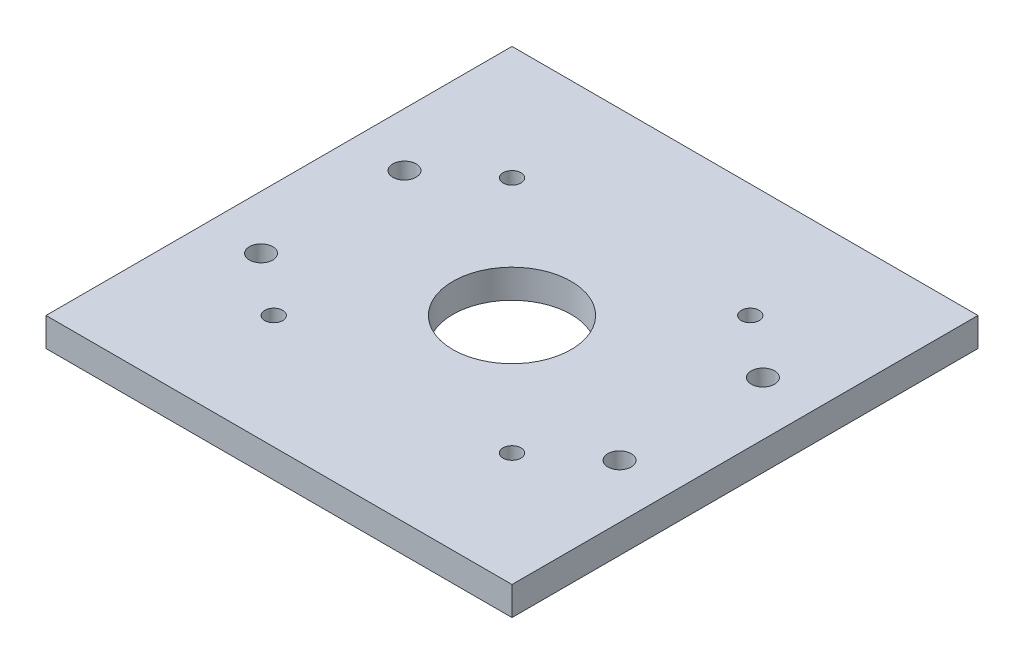
ISO-10303-21;
HEADER;
FILE_DESCRIPTION(('STEP AP214'),'2;1');
FILE_NAME('part.step','',(''),(''),'','','');
FILE_SCHEMA(('AUTOMOTIVE_DESIGN { 1 0 10303 214 1 1 1 1 }'));
ENDSEC;
DATA;
#1=APPLICATION_CONTEXT('core data for automotive mechanical design processes');
#2=APPLICATION_PROTOCOL_DEFINITION('international standard','automotive_design',2000,#1);
#3=PRODUCT_CONTEXT('',#1,'mechanical');
#4=PRODUCT('Part','Part','',(#3));
#5=PRODUCT_RELATED_PRODUCT_CATEGORY('part','',(#4));
#6=PRODUCT_DEFINITION_FORMATION('','',#4);
#7=PRODUCT_DEFINITION_CONTEXT('part definition',#1,'design');
#8=PRODUCT_DEFINITION('design','',#6,#7);
#9=PRODUCT_DEFINITION_SHAPE('','',#8);
#10=(LENGTH_UNIT() NAMED_UNIT(*) SI_UNIT(.MILLI.,.METRE.));
#11=(NAMED_UNIT(*) PLANE_ANGLE_UNIT() SI_UNIT($,.RADIAN.));
#12=(NAMED_UNIT(*) SI_UNIT($,.STERADIAN.) SOLID_ANGLE_UNIT());
#13=UNCERTAINTY_MEASURE_WITH_UNIT(LENGTH_MEASURE(1.E-05),#10,'distance_accuracy_value','');
#14=(GEOMETRIC_REPRESENTATION_CONTEXT(3) GLOBAL_UNCERTAINTY_ASSIGNED_CONTEXT((#13)) GLOBAL_UNIT_ASSIGNED_CONTEXT((#10,
#11,#12)) REPRESENTATION_CONTEXT('',''));
#15=CARTESIAN_POINT('',(0.,0.,0.));
#16=DIRECTION('',(0.,0.,1.));
#17=DIRECTION('',(1.,0.,0.));
#18=AXIS2_PLACEMENT_3D('',#15,#16,#17);
#19=CARTESIAN_POINT('',(0.,8.,0.));
#20=DIRECTION('',(0.,-1.,0.));
#21=DIRECTION('',(0.,0.,-1.));
#22=AXIS2_PLACEMENT_3D('',#19,#20,#21);
#23=PLANE('',#22);
#24=CARTESIAN_POINT('',(-301.704286076689,8.,109.175068710218));
#25=DIRECTION('',(0.,1.,0.));
#26=DIRECTION('',(0.,0.,1.));
#27=AXIS2_PLACEMENT_3D('',#24,#25,#26);
#28=CIRCLE('',#27,2.5);
#29=CARTESIAN_POINT('',(-301.704286076689,8.,111.675068710218));
#30=VERTEX_POINT('',#29);
#31=EDGE_CURVE('E210',#30,#30,#28,.T.);
#32=ORIENTED_EDGE('',*,*,#31,.F.);
#33=EDGE_LOOP('',(#32));
#34=FACE_BOUND('',#33,.T.);
#35=CARTESIAN_POINT('',(-235.236286076689,8.,109.175068710218));
#36=DIRECTION('',(0.,1.,0.));
#37=DIRECTION('',(0.,0.,1.));
#38=AXIS2_PLACEMENT_3D('',#35,#36,#37);
#39=CIRCLE('',#38,2.5);
#40=CARTESIAN_POINT('',(-235.236286076689,8.,111.675068710218));
#41=VERTEX_POINT('',#40);
#42=EDGE_CURVE('E200',#41,#41,#39,.T.);
#43=ORIENTED_EDGE('',*,*,#42,.F.);
#44=EDGE_LOOP('',(#43));
#45=FACE_BOUND('',#44,.T.);
#46=CARTESIAN_POINT('',(-218.470286076689,8.,162.409068710218));
#47=DIRECTION('',(0.,1.,0.));
#48=DIRECTION('',(0.,0.,1.));
#49=AXIS2_PLACEMENT_3D('',#46,#47,#48);
#50=CIRCLE('',#49,3.25000000000001);
#51=CARTESIAN_POINT('',(-218.470286076689,8.,165.659068710218));
#52=VERTEX_POINT('',#51);
#53=EDGE_CURVE('E159',#52,#52,#50,.T.);
#54=ORIENTED_EDGE('',*,*,#53,.F.);
#55=EDGE_LOOP('',(#54));
#56=FACE_BOUND('',#55,.T.);
#57=CARTESIAN_POINT('',(-218.470286076689,8.,122.409068710218));
#58=DIRECTION('',(0.,1.,0.));
#59=DIRECTION('',(0.,0.,1.));
#60=AXIS2_PLACEMENT_3D('',#57,#58,#59);
#61=CIRCLE('',#60,3.25000000000001);
#62=CARTESIAN_POINT('',(-218.470286076689,8.,125.659068710218));
#63=VERTEX_POINT('',#62);
#64=EDGE_CURVE('E166',#63,#63,#61,.T.);
#65=ORIENTED_EDGE('',*,*,#64,.F.);
#66=EDGE_LOOP('',(#65));
#67=FACE_BOUND('',#66,.T.);
#68=CARTESIAN_POINT('',(-318.470286076689,8.,122.409068710218));
#69=DIRECTION('',(0.,1.,0.));
#70=DIRECTION('',(0.,0.,1.));
#71=AXIS2_PLACEMENT_3D('',#68,#69,#70);
#72=CIRCLE('',#71,3.24999999999995);
#73=CARTESIAN_POINT('',(-318.470286076689,8.,125.659068710218));
#74=VERTEX_POINT('',#73);
#75=EDGE_CURVE('E155',#74,#74,#72,.T.);
#76=ORIENTED_EDGE('',*,*,#75,.F.);
#77=EDGE_LOOP('',(#76));
#78=FACE_BOUND('',#77,.T.);
#79=CARTESIAN_POINT('',(-318.470286076689,8.,162.409068710218));
#80=DIRECTION('',(0.,1.,0.));
#81=DIRECTION('',(0.,0.,1.));
#82=AXIS2_PLACEMENT_3D('',#79,#80,#81);
#83=CIRCLE('',#82,3.24999999999995);
#84=CARTESIAN_POINT('',(-318.470286076689,8.,165.659068710218));
#85=VERTEX_POINT('',#84);
#86=EDGE_CURVE('E146',#85,#85,#83,.T.);
#87=ORIENTED_EDGE('',*,*,#86,.F.);
#88=EDGE_LOOP('',(#87));
#89=FACE_BOUND('',#88,.T.);
#90=DIRECTION('',(0.,0.,1.));
#91=VECTOR('',#90,1.);
#92=CARTESIAN_POINT('',(-333.470286076689,8.,207.409068710218));
#93=LINE('',#92,#91);
#94=CARTESIAN_POINT('',(-333.470286076689,8.,77.409068710218));
#95=VERTEX_POINT('',#94);
#96=CARTESIAN_POINT('',(-333.470286076689,8.,207.409068710218));
#97=VERTEX_POINT('',#96);
#98=EDGE_CURVE('E105',#95,#97,#93,.T.);
#99=ORIENTED_EDGE('',*,*,#98,.T.);
#100=DIRECTION('',(1.,0.,0.));
#101=VECTOR('',#100,1.);
#102=CARTESIAN_POINT('',(-333.470286076689,8.,207.409068710218));
#103=LINE('',#102,#101);
#104=CARTESIAN_POINT('',(-203.470286076689,8.,207.409068710218));
#105=VERTEX_POINT('',#104);
#106=EDGE_CURVE('E100',#97,#105,#103,.T.);
#107=ORIENTED_EDGE('',*,*,#106,.T.);
#108=DIRECTION('',(0.,0.,-1.));
#109=VECTOR('',#108,1.);
#110=CARTESIAN_POINT('',(-203.470286076689,8.,207.409068710218));
#111=LINE('',#110,#109);
#112=CARTESIAN_POINT('',(-203.470286076689,8.,77.409068710218));
#113=VERTEX_POINT('',#112);
#114=EDGE_CURVE('E99',#105,#113,#111,.T.);
#115=ORIENTED_EDGE('',*,*,#114,.T.);
#116=DIRECTION('',(-1.,0.,0.));
#117=VECTOR('',#116,1.);
#118=CARTESIAN_POINT('',(-333.470286076689,8.,77.409068710218));
#119=LINE('',#118,#117);
#120=EDGE_CURVE('E67',#113,#95,#119,.T.);
#121=ORIENTED_EDGE('',*,*,#120,.T.);
#122=EDGE_LOOP('',(#99,#107,#115,#121));
#123=FACE_BOUND('',#122,.T.);
#124=CARTESIAN_POINT('',(-268.470286076689,8.,142.409068710218));
#125=DIRECTION('',(0.,1.,0.));
#126=DIRECTION('',(0.,0.,1.));
#127=AXIS2_PLACEMENT_3D('',#124,#125,#126);
#128=CIRCLE('',#127,16.5);
#129=CARTESIAN_POINT('',(-268.470286076689,8.,158.909068710218));
#130=VERTEX_POINT('',#129);
#131=EDGE_CURVE('E122',#130,#130,#128,.T.);
#132=ORIENTED_EDGE('',*,*,#131,.F.);
#133=EDGE_LOOP('',(#132));
#134=FACE_BOUND('',#133,.T.);
#135=CARTESIAN_POINT('',(-301.704286076689,8.,175.643068710218));
#136=DIRECTION('',(0.,1.,0.));
#137=DIRECTION('',(0.,0.,1.));
#138=AXIS2_PLACEMENT_3D('',#135,#136,#137);
#139=CIRCLE('',#138,2.5);
#140=CARTESIAN_POINT('',(-301.704286076689,8.,178.143068710218));
#141=VERTEX_POINT('',#140);
#142=EDGE_CURVE('E181',#141,#141,#139,.T.);
#143=ORIENTED_EDGE('',*,*,#142,.F.);
#144=EDGE_LOOP('',(#143));
#145=FACE_BOUND('',#144,.T.);
#146=CARTESIAN_POINT('',(-235.236286076689,8.,175.643068710218));
#147=DIRECTION('',(0.,1.,0.));
#148=DIRECTION('',(0.,0.,1.));
#149=AXIS2_PLACEMENT_3D('',#146,#147,#148);
#150=CIRCLE('',#149,2.5);
#151=CARTESIAN_POINT('',(-235.236286076689,8.,178.143068710218));
#152=VERTEX_POINT('',#151);
#153=EDGE_CURVE('E191',#152,#152,#150,.T.);
#154=ORIENTED_EDGE('',*,*,#153,.F.);
#155=EDGE_LOOP('',(#154));
#156=FACE_BOUND('',#155,.T.);
#157=ADVANCED_FACE('F47',(#34,#45,#56,#67,#78,#89,#123,#134,#145,#156),#23,.F.);
#158=CARTESIAN_POINT('',(0.,0.,0.));
#159=DIRECTION('',(0.,-1.,0.));
#160=DIRECTION('',(0.,0.,-1.));
#161=AXIS2_PLACEMENT_3D('',#158,#159,#160);
#162=PLANE('',#161);
#163=CARTESIAN_POINT('',(-301.704286076689,0.,109.175068710218));
#164=DIRECTION('',(0.,1.,0.));
#165=DIRECTION('',(0.,0.,1.));
#166=AXIS2_PLACEMENT_3D('',#163,#164,#165);
#167=CIRCLE('',#166,2.5);
#168=CARTESIAN_POINT('',(-301.704286076689,0.,111.675068710218));
#169=VERTEX_POINT('',#168);
#170=EDGE_CURVE('E201',#169,#169,#167,.T.);
#171=ORIENTED_EDGE('',*,*,#170,.T.);
#172=EDGE_LOOP('',(#171));
#173=FACE_BOUND('',#172,.T.);
#174=CARTESIAN_POINT('',(-235.236286076689,0.,109.175068710218));
#175=DIRECTION('',(0.,1.,0.));
#176=DIRECTION('',(0.,0.,1.));
#177=AXIS2_PLACEMENT_3D('',#174,#175,#176);
#178=CIRCLE('',#177,2.5);
#179=CARTESIAN_POINT('',(-235.236286076689,0.,111.675068710218));
#180=VERTEX_POINT('',#179);
#181=EDGE_CURVE('E195',#180,#180,#178,.T.);
#182=ORIENTED_EDGE('',*,*,#181,.T.);
#183=EDGE_LOOP('',(#182));
#184=FACE_BOUND('',#183,.T.);
#185=CARTESIAN_POINT('',(-235.236286076689,0.,175.643068710218));
#186=DIRECTION('',(0.,1.,0.));
#187=DIRECTION('',(0.,0.,1.));
#188=AXIS2_PLACEMENT_3D('',#185,#186,#187);
#189=CIRCLE('',#188,2.5);
#190=CARTESIAN_POINT('',(-235.236286076689,0.,178.143068710218));
#191=VERTEX_POINT('',#190);
#192=EDGE_CURVE('E190',#191,#191,#189,.T.);
#193=ORIENTED_EDGE('',*,*,#192,.T.);
#194=EDGE_LOOP('',(#193));
#195=FACE_BOUND('',#194,.T.);
#196=CARTESIAN_POINT('',(-268.470286076689,0.,142.409068710218));
#197=DIRECTION('',(0.,1.,0.));
#198=DIRECTION('',(0.,0.,1.));
#199=AXIS2_PLACEMENT_3D('',#196,#197,#198);
#200=CIRCLE('',#199,16.5);
#201=CARTESIAN_POINT('',(-268.470286076689,0.,158.909068710218));
#202=VERTEX_POINT('',#201);
#203=EDGE_CURVE('E140',#202,#202,#200,.T.);
#204=ORIENTED_EDGE('',*,*,#203,.T.);
#205=EDGE_LOOP('',(#204));
#206=FACE_BOUND('',#205,.T.);
#207=DIRECTION('',(0.,0.,1.));
#208=VECTOR('',#207,1.);
#209=CARTESIAN_POINT('',(-333.470286076689,0.,207.409068710218));
#210=LINE('',#209,#208);
#211=CARTESIAN_POINT('',(-333.470286076689,0.,77.409068710218));
#212=VERTEX_POINT('',#211);
#213=CARTESIAN_POINT('',(-333.470286076689,0.,207.409068710218));
#214=VERTEX_POINT('',#213);
#215=EDGE_CURVE('E119',#212,#214,#210,.T.);
#216=ORIENTED_EDGE('',*,*,#215,.F.);
#217=DIRECTION('',(-1.,0.,0.));
#218=VECTOR('',#217,1.);
#219=CARTESIAN_POINT('',(-333.470286076689,0.,77.409068710218));
#220=LINE('',#219,#218);
#221=CARTESIAN_POINT('',(-203.470286076689,0.,77.409068710218));
#222=VERTEX_POINT('',#221);
#223=EDGE_CURVE('E89',#222,#212,#220,.T.);
#224=ORIENTED_EDGE('',*,*,#223,.F.);
#225=DIRECTION('',(0.,0.,-1.));
#226=VECTOR('',#225,1.);
#227=CARTESIAN_POINT('',(-203.470286076689,0.,207.409068710218));
#228=LINE('',#227,#226);
#229=CARTESIAN_POINT('',(-203.470286076689,0.,207.409068710218));
#230=VERTEX_POINT('',#229);
#231=EDGE_CURVE('E83',#230,#222,#228,.T.);
#232=ORIENTED_EDGE('',*,*,#231,.F.);
#233=DIRECTION('',(1.,0.,0.));
#234=VECTOR('',#233,1.);
#235=CARTESIAN_POINT('',(-333.470286076689,0.,207.409068710218));
#236=LINE('',#235,#234);
#237=EDGE_CURVE('E110',#214,#230,#236,.T.);
#238=ORIENTED_EDGE('',*,*,#237,.F.);
#239=EDGE_LOOP('',(#216,#224,#232,#238));
#240=FACE_BOUND('',#239,.T.);
#241=CARTESIAN_POINT('',(-318.470286076689,0.,162.409068710218));
#242=DIRECTION('',(0.,1.,0.));
#243=DIRECTION('',(0.,0.,1.));
#244=AXIS2_PLACEMENT_3D('',#241,#242,#243);
#245=CIRCLE('',#244,3.24999999999995);
#246=CARTESIAN_POINT('',(-318.470286076689,0.,165.659068710218));
#247=VERTEX_POINT('',#246);
#248=EDGE_CURVE('E145',#247,#247,#245,.T.);
#249=ORIENTED_EDGE('',*,*,#248,.T.);
#250=EDGE_LOOP('',(#249));
#251=FACE_BOUND('',#250,.T.);
#252=CARTESIAN_POINT('',(-318.470286076689,0.,122.409068710218));
#253=DIRECTION('',(0.,1.,0.));
#254=DIRECTION('',(0.,0.,1.));
#255=AXIS2_PLACEMENT_3D('',#252,#253,#254);
#256=CIRCLE('',#255,3.24999999999995);
#257=CARTESIAN_POINT('',(-318.470286076689,0.,125.659068710218));
#258=VERTEX_POINT('',#257);
#259=EDGE_CURVE('E174',#258,#258,#256,.T.);
#260=ORIENTED_EDGE('',*,*,#259,.T.);
#261=EDGE_LOOP('',(#260));
#262=FACE_BOUND('',#261,.T.);
#263=CARTESIAN_POINT('',(-218.470286076689,0.,122.409068710218));
#264=DIRECTION('',(0.,1.,0.));
#265=DIRECTION('',(0.,0.,1.));
#266=AXIS2_PLACEMENT_3D('',#263,#264,#265);
#267=CIRCLE('',#266,3.25000000000001);
#268=CARTESIAN_POINT('',(-218.470286076689,0.,125.659068710218));
#269=VERTEX_POINT('',#268);
#270=EDGE_CURVE('E164',#269,#269,#267,.T.);
#271=ORIENTED_EDGE('',*,*,#270,.T.);
#272=EDGE_LOOP('',(#271));
#273=FACE_BOUND('',#272,.T.);
#274=CARTESIAN_POINT('',(-218.470286076689,0.,162.409068710218));
#275=DIRECTION('',(0.,1.,0.));
#276=DIRECTION('',(0.,0.,1.));
#277=AXIS2_PLACEMENT_3D('',#274,#275,#276);
#278=CIRCLE('',#277,3.25000000000001);
#279=CARTESIAN_POINT('',(-218.470286076689,0.,165.659068710218));
#280=VERTEX_POINT('',#279);
#281=EDGE_CURVE('E156',#280,#280,#278,.T.);
#282=ORIENTED_EDGE('',*,*,#281,.T.);
#283=EDGE_LOOP('',(#282));
#284=FACE_BOUND('',#283,.T.);
#285=CARTESIAN_POINT('',(-301.704286076689,0.,175.643068710218));
#286=DIRECTION('',(0.,1.,0.));
#287=DIRECTION('',(0.,0.,1.));
#288=AXIS2_PLACEMENT_3D('',#285,#286,#287);
#289=CIRCLE('',#288,2.5);
#290=CARTESIAN_POINT('',(-301.704286076689,0.,178.143068710218));
#291=VERTEX_POINT('',#290);
#292=EDGE_CURVE('E161',#291,#291,#289,.T.);
#293=ORIENTED_EDGE('',*,*,#292,.T.);
#294=EDGE_LOOP('',(#293));
#295=FACE_BOUND('',#294,.T.);
#296=ADVANCED_FACE('F133',(#173,#184,#195,#206,#240,#251,#262,#273,#284,#295),#162,.T.);
#297=CARTESIAN_POINT('',(-333.470286076689,8.,207.409068710218));
#298=DIRECTION('',(1.,0.,0.));
#299=DIRECTION('',(0.,0.,-1.));
#300=AXIS2_PLACEMENT_3D('',#297,#298,#299);
#301=PLANE('',#300);
#302=ORIENTED_EDGE('',*,*,#215,.T.);
#303=DIRECTION('',(0.,-1.,0.));
#304=VECTOR('',#303,1.);
#305=CARTESIAN_POINT('',(-333.470286076689,8.,207.409068710218));
#306=LINE('',#305,#304);
#307=EDGE_CURVE('E11',#97,#214,#306,.T.);
#308=ORIENTED_EDGE('',*,*,#307,.F.);
#309=ORIENTED_EDGE('',*,*,#98,.F.);
#310=DIRECTION('',(0.,-1.,0.));
#311=VECTOR('',#310,1.);
#312=CARTESIAN_POINT('',(-333.470286076689,8.,77.409068710218));
#313=LINE('',#312,#311);
#314=EDGE_CURVE('E111',#95,#212,#313,.T.);
#315=ORIENTED_EDGE('',*,*,#314,.T.);
#316=EDGE_LOOP('',(#302,#308,#309,#315));
#317=FACE_BOUND('',#316,.T.);
#318=ADVANCED_FACE('F51',(#317),#301,.F.);
#319=CARTESIAN_POINT('',(-333.470286076689,8.,207.409068710218));
#320=DIRECTION('',(0.,0.,-1.));
#321=DIRECTION('',(-1.,0.,0.));
#322=AXIS2_PLACEMENT_3D('',#319,#320,#321);
#323=PLANE('',#322);
#324=ORIENTED_EDGE('',*,*,#237,.T.);
#325=DIRECTION('',(0.,-1.,0.));
#326=VECTOR('',#325,1.);
#327=CARTESIAN_POINT('',(-203.470286076689,8.,207.409068710218));
#328=LINE('',#327,#326);
#329=EDGE_CURVE('E56',#105,#230,#328,.T.);
#330=ORIENTED_EDGE('',*,*,#329,.F.);
#331=ORIENTED_EDGE('',*,*,#106,.F.);
#332=ORIENTED_EDGE('',*,*,#307,.T.);
#333=EDGE_LOOP('',(#324,#330,#331,#332));
#334=FACE_BOUND('',#333,.T.);
#335=ADVANCED_FACE('F106',(#334),#323,.F.);
#336=CARTESIAN_POINT('',(-203.470286076689,8.,207.409068710218));
#337=DIRECTION('',(-1.,0.,0.));
#338=DIRECTION('',(0.,0.,1.));
#339=AXIS2_PLACEMENT_3D('',#336,#337,#338);
#340=PLANE('',#339);
#341=ORIENTED_EDGE('',*,*,#231,.T.);
#342=DIRECTION('',(0.,-1.,0.));
#343=VECTOR('',#342,1.);
#344=CARTESIAN_POINT('',(-203.470286076689,8.,77.409068710218));
#345=LINE('',#344,#343);
#346=EDGE_CURVE('E108',#113,#222,#345,.T.);
#347=ORIENTED_EDGE('',*,*,#346,.F.);
#348=ORIENTED_EDGE('',*,*,#114,.F.);
#349=ORIENTED_EDGE('',*,*,#329,.T.);
#350=EDGE_LOOP('',(#341,#347,#348,#349));
#351=FACE_BOUND('',#350,.T.);
#352=ADVANCED_FACE('F109',(#351),#340,.F.);
#353=CARTESIAN_POINT('',(-333.470286076689,8.,77.409068710218));
#354=DIRECTION('',(0.,0.,1.));
#355=DIRECTION('',(1.,0.,0.));
#356=AXIS2_PLACEMENT_3D('',#353,#354,#355);
#357=PLANE('',#356);
#358=ORIENTED_EDGE('',*,*,#223,.T.);
#359=ORIENTED_EDGE('',*,*,#314,.F.);
#360=ORIENTED_EDGE('',*,*,#120,.F.);
#361=ORIENTED_EDGE('',*,*,#346,.T.);
#362=EDGE_LOOP('',(#358,#359,#360,#361));
#363=FACE_BOUND('',#362,.T.);
#364=ADVANCED_FACE('F135',(#363),#357,.F.);
#365=CARTESIAN_POINT('',(-268.470286076689,8.,142.409068710218));
#366=DIRECTION('',(0.,-1.,0.));
#367=DIRECTION('',(0.,0.,-1.));
#368=AXIS2_PLACEMENT_3D('',#365,#366,#367);
#369=CYLINDRICAL_SURFACE('',#368,16.5);
#370=ORIENTED_EDGE('',*,*,#131,.T.);
#371=EDGE_LOOP('',(#370));
#372=FACE_BOUND('',#371,.T.);
#373=ORIENTED_EDGE('',*,*,#203,.F.);
#374=EDGE_LOOP('',(#373));
#375=FACE_BOUND('',#374,.T.);
#376=ADVANCED_FACE('F228',(#372,#375),#369,.F.);
#377=CARTESIAN_POINT('',(-318.470286076689,0.,162.409068710218));
#378=DIRECTION('',(0.,1.,0.));
#379=DIRECTION('',(0.,0.,1.));
#380=AXIS2_PLACEMENT_3D('',#377,#378,#379);
#381=CYLINDRICAL_SURFACE('',#380,3.24999999999995);
#382=ORIENTED_EDGE('',*,*,#248,.F.);
#383=EDGE_LOOP('',(#382));
#384=FACE_BOUND('',#383,.T.);
#385=ORIENTED_EDGE('',*,*,#86,.T.);
#386=EDGE_LOOP('',(#385));
#387=FACE_BOUND('',#386,.T.);
#388=ADVANCED_FACE('F230',(#384,#387),#381,.F.);
#389=CARTESIAN_POINT('',(-318.470286076689,0.,122.409068710218));
#390=DIRECTION('',(0.,1.,0.));
#391=DIRECTION('',(0.,0.,1.));
#392=AXIS2_PLACEMENT_3D('',#389,#390,#391);
#393=CYLINDRICAL_SURFACE('',#392,3.24999999999995);
#394=ORIENTED_EDGE('',*,*,#259,.F.);
#395=EDGE_LOOP('',(#394));
#396=FACE_BOUND('',#395,.T.);
#397=ORIENTED_EDGE('',*,*,#75,.T.);
#398=EDGE_LOOP('',(#397));
#399=FACE_BOUND('',#398,.T.);
#400=ADVANCED_FACE('F226',(#396,#399),#393,.F.);
#401=CARTESIAN_POINT('',(-218.470286076689,0.,122.409068710218));
#402=DIRECTION('',(0.,1.,0.));
#403=DIRECTION('',(0.,0.,1.));
#404=AXIS2_PLACEMENT_3D('',#401,#402,#403);
#405=CYLINDRICAL_SURFACE('',#404,3.25000000000001);
#406=ORIENTED_EDGE('',*,*,#270,.F.);
#407=EDGE_LOOP('',(#406));
#408=FACE_BOUND('',#407,.T.);
#409=ORIENTED_EDGE('',*,*,#64,.T.);
#410=EDGE_LOOP('',(#409));
#411=FACE_BOUND('',#410,.T.);
#412=ADVANCED_FACE('F240',(#408,#411),#405,.F.);
#413=CARTESIAN_POINT('',(-218.470286076689,0.,162.409068710218));
#414=DIRECTION('',(0.,1.,0.));
#415=DIRECTION('',(0.,0.,1.));
#416=AXIS2_PLACEMENT_3D('',#413,#414,#415);
#417=CYLINDRICAL_SURFACE('',#416,3.25000000000001);
#418=ORIENTED_EDGE('',*,*,#281,.F.);
#419=EDGE_LOOP('',(#418));
#420=FACE_BOUND('',#419,.T.);
#421=ORIENTED_EDGE('',*,*,#53,.T.);
#422=EDGE_LOOP('',(#421));
#423=FACE_BOUND('',#422,.T.);
#424=ADVANCED_FACE('F241',(#420,#423),#417,.F.);
#425=CARTESIAN_POINT('',(-301.704286076689,8.,175.643068710218));
#426=DIRECTION('',(0.,1.,0.));
#427=DIRECTION('',(0.,0.,1.));
#428=AXIS2_PLACEMENT_3D('',#425,#426,#427);
#429=CYLINDRICAL_SURFACE('',#428,2.5);
#430=ORIENTED_EDGE('',*,*,#292,.F.);
#431=EDGE_LOOP('',(#430));
#432=FACE_BOUND('',#431,.T.);
#433=ORIENTED_EDGE('',*,*,#142,.T.);
#434=EDGE_LOOP('',(#433));
#435=FACE_BOUND('',#434,.T.);
#436=ADVANCED_FACE('F310',(#432,#435),#429,.F.);
#437=CARTESIAN_POINT('',(-235.236286076689,8.,175.643068710218));
#438=DIRECTION('',(0.,1.,0.));
#439=DIRECTION('',(0.,0.,1.));
#440=AXIS2_PLACEMENT_3D('',#437,#438,#439);
#441=CYLINDRICAL_SURFACE('',#440,2.5);
#442=ORIENTED_EDGE('',*,*,#192,.F.);
#443=EDGE_LOOP('',(#442));
#444=FACE_BOUND('',#443,.T.);
#445=ORIENTED_EDGE('',*,*,#153,.T.);
#446=EDGE_LOOP('',(#445));
#447=FACE_BOUND('',#446,.T.);
#448=ADVANCED_FACE('F335',(#444,#447),#441,.F.);
#449=CARTESIAN_POINT('',(-235.236286076689,8.,109.175068710218));
#450=DIRECTION('',(0.,1.,0.));
#451=DIRECTION('',(0.,0.,1.));
#452=AXIS2_PLACEMENT_3D('',#449,#450,#451);
#453=CYLINDRICAL_SURFACE('',#452,2.5);
#454=ORIENTED_EDGE('',*,*,#181,.F.);
#455=EDGE_LOOP('',(#454));
#456=FACE_BOUND('',#455,.T.);
#457=ORIENTED_EDGE('',*,*,#42,.T.);
#458=EDGE_LOOP('',(#457));
#459=FACE_BOUND('',#458,.T.);
#460=ADVANCED_FACE('F343',(#456,#459),#453,.F.);
#461=CARTESIAN_POINT('',(-301.704286076689,8.,109.175068710218));
#462=DIRECTION('',(0.,1.,0.));
#463=DIRECTION('',(0.,0.,1.));
#464=AXIS2_PLACEMENT_3D('',#461,#462,#463);
#465=CYLINDRICAL_SURFACE('',#464,2.5);
#466=ORIENTED_EDGE('',*,*,#170,.F.);
#467=EDGE_LOOP('',(#466));
#468=FACE_BOUND('',#467,.T.);
#469=ORIENTED_EDGE('',*,*,#31,.T.);
#470=EDGE_LOOP('',(#469));
#471=FACE_BOUND('',#470,.T.);
#472=ADVANCED_FACE('F215',(#468,#471),#465,.F.);
#473=CLOSED_SHELL('',(#157,#296,#318,#335,#352,#364,#376,#388,#400,#412,#424,#436,#448,#460,#472));
#474=MANIFOLD_SOLID_BREP('B2',#473);
#475=ADVANCED_BREP_SHAPE_REPRESENTATION('',(#18,#474),#14);
#476=SHAPE_DEFINITION_REPRESENTATION(#9,#475);
ENDSEC;
END-ISO-10303-21;
